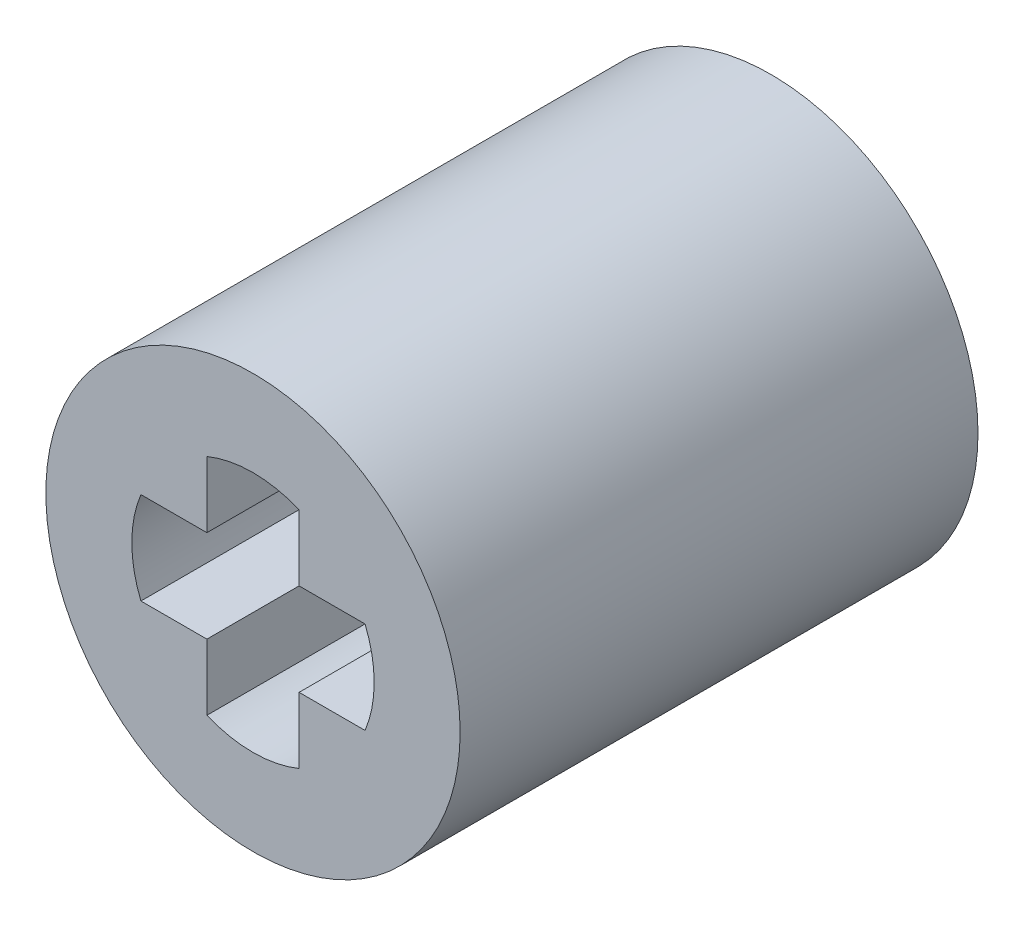
ISO-10303-21;
HEADER;
FILE_DESCRIPTION(('STEP AP214'),'2;1');
FILE_NAME('part.step','',(''),(''),'','','');
FILE_SCHEMA(('AUTOMOTIVE_DESIGN { 1 0 10303 214 1 1 1 1 }'));
ENDSEC;
DATA;
#1=APPLICATION_CONTEXT('core data for automotive mechanical design processes');
#2=APPLICATION_PROTOCOL_DEFINITION('international standard','automotive_design',2000,#1);
#3=PRODUCT_CONTEXT('',#1,'mechanical');
#4=PRODUCT('Part','Part','',(#3));
#5=PRODUCT_RELATED_PRODUCT_CATEGORY('part','',(#4));
#6=PRODUCT_DEFINITION_FORMATION('','',#4);
#7=PRODUCT_DEFINITION_CONTEXT('part definition',#1,'design');
#8=PRODUCT_DEFINITION('design','',#6,#7);
#9=PRODUCT_DEFINITION_SHAPE('','',#8);
#10=(LENGTH_UNIT() NAMED_UNIT(*) SI_UNIT(.MILLI.,.METRE.));
#11=(NAMED_UNIT(*) PLANE_ANGLE_UNIT() SI_UNIT($,.RADIAN.));
#12=(NAMED_UNIT(*) SI_UNIT($,.STERADIAN.) SOLID_ANGLE_UNIT());
#13=UNCERTAINTY_MEASURE_WITH_UNIT(LENGTH_MEASURE(1.E-05),#10,'distance_accuracy_value','');
#14=(GEOMETRIC_REPRESENTATION_CONTEXT(3) GLOBAL_UNCERTAINTY_ASSIGNED_CONTEXT((#13)) GLOBAL_UNIT_ASSIGNED_CONTEXT((#10,
#11,#12)) REPRESENTATION_CONTEXT('',''));
#15=CARTESIAN_POINT('',(0.,0.,0.));
#16=DIRECTION('',(0.,0.,1.));
#17=DIRECTION('',(1.,0.,0.));
#18=AXIS2_PLACEMENT_3D('',#15,#16,#17);
#19=CARTESIAN_POINT('',(0.,0.,0.));
#20=DIRECTION('',(0.,0.,1.));
#21=DIRECTION('',(1.,0.,0.));
#22=AXIS2_PLACEMENT_3D('',#19,#20,#21);
#23=PLANE('',#22);
#24=CARTESIAN_POINT('',(0.,0.,0.));
#25=DIRECTION('',(0.,0.,1.));
#26=DIRECTION('',(1.,0.,0.));
#27=AXIS2_PLACEMENT_3D('',#24,#25,#26);
#28=CIRCLE('',#27,1.5);
#29=CARTESIAN_POINT('',(-1.20743529847359,-0.89,0.));
#30=VERTEX_POINT('',#29);
#31=CARTESIAN_POINT('',(-0.889999999999999,-1.20743529847359,0.));
#32=VERTEX_POINT('',#31);
#33=EDGE_CURVE('E11',#30,#32,#28,.T.);
#34=ORIENTED_EDGE('',*,*,#33,.F.);
#35=DIRECTION('',(1.,0.,0.));
#36=VECTOR('',#35,1.);
#37=CARTESIAN_POINT('',(0.,-0.89,0.));
#38=LINE('',#37,#36);
#39=CARTESIAN_POINT('',(-0.89,-0.89,0.));
#40=VERTEX_POINT('',#39);
#41=EDGE_CURVE('E98',#30,#40,#38,.T.);
#42=ORIENTED_EDGE('',*,*,#41,.T.);
#43=DIRECTION('',(0.,-1.,0.));
#44=VECTOR('',#43,1.);
#45=CARTESIAN_POINT('',(-0.89,0.,0.));
#46=LINE('',#45,#44);
#47=EDGE_CURVE('E143',#40,#32,#46,.T.);
#48=ORIENTED_EDGE('',*,*,#47,.T.);
#49=EDGE_LOOP('',(#34,#42,#48));
#50=FACE_BOUND('',#49,.T.);
#51=ADVANCED_FACE('F47',(#50),#23,.F.);
#52=CARTESIAN_POINT('',(0.889999999999999,-1.20743529847359,0.));
#53=VERTEX_POINT('',#52);
#54=CARTESIAN_POINT('',(1.20743529847359,-0.89,0.));
#55=VERTEX_POINT('',#54);
#56=EDGE_CURVE('E57',#53,#55,#28,.T.);
#57=ORIENTED_EDGE('',*,*,#56,.F.);
#58=DIRECTION('',(0.,1.,0.));
#59=VECTOR('',#58,1.);
#60=CARTESIAN_POINT('',(0.89,0.,0.));
#61=LINE('',#60,#59);
#62=CARTESIAN_POINT('',(0.89,-0.89,0.));
#63=VERTEX_POINT('',#62);
#64=EDGE_CURVE('E205',#53,#63,#61,.T.);
#65=ORIENTED_EDGE('',*,*,#64,.T.);
#66=DIRECTION('',(1.,0.,0.));
#67=VECTOR('',#66,1.);
#68=CARTESIAN_POINT('',(0.,-0.89,0.));
#69=LINE('',#68,#67);
#70=EDGE_CURVE('E201',#63,#55,#69,.T.);
#71=ORIENTED_EDGE('',*,*,#70,.T.);
#72=EDGE_LOOP('',(#57,#65,#71));
#73=FACE_BOUND('',#72,.T.);
#74=ADVANCED_FACE('F313',(#73),#23,.F.);
#75=CARTESIAN_POINT('',(-1.11803398874989,1.,0.));
#76=VERTEX_POINT('',#75);
#77=CARTESIAN_POINT('',(-1.20743529847359,0.89,0.));
#78=VERTEX_POINT('',#77);
#79=EDGE_CURVE('E270',#76,#78,#28,.T.);
#80=ORIENTED_EDGE('',*,*,#79,.F.);
#81=DIRECTION('',(1.,0.,0.));
#82=VECTOR('',#81,1.);
#83=CARTESIAN_POINT('',(0.,1.,0.));
#84=LINE('',#83,#82);
#85=CARTESIAN_POINT('',(-0.89,1.,0.));
#86=VERTEX_POINT('',#85);
#87=EDGE_CURVE('E265',#76,#86,#84,.T.);
#88=ORIENTED_EDGE('',*,*,#87,.T.);
#89=DIRECTION('',(0.,-1.,0.));
#90=VECTOR('',#89,1.);
#91=CARTESIAN_POINT('',(-0.89,0.,0.));
#92=LINE('',#91,#90);
#93=CARTESIAN_POINT('',(-0.89,0.89,0.));
#94=VERTEX_POINT('',#93);
#95=EDGE_CURVE('E179',#86,#94,#92,.T.);
#96=ORIENTED_EDGE('',*,*,#95,.T.);
#97=DIRECTION('',(1.,0.,0.));
#98=VECTOR('',#97,1.);
#99=CARTESIAN_POINT('',(0.,0.89,0.));
#100=LINE('',#99,#98);
#101=EDGE_CURVE('E180',#78,#94,#100,.T.);
#102=ORIENTED_EDGE('',*,*,#101,.F.);
#103=EDGE_LOOP('',(#80,#88,#96,#102));
#104=FACE_BOUND('',#103,.T.);
#105=ADVANCED_FACE('F456',(#104),#23,.F.);
#106=CARTESIAN_POINT('',(1.20743529847359,0.89,0.));
#107=VERTEX_POINT('',#106);
#108=CARTESIAN_POINT('',(1.11803398874989,1.,0.));
#109=VERTEX_POINT('',#108);
#110=EDGE_CURVE('E263',#107,#109,#28,.T.);
#111=ORIENTED_EDGE('',*,*,#110,.F.);
#112=DIRECTION('',(1.,0.,0.));
#113=VECTOR('',#112,1.);
#114=CARTESIAN_POINT('',(0.,0.89,0.));
#115=LINE('',#114,#113);
#116=CARTESIAN_POINT('',(0.89,0.89,0.));
#117=VERTEX_POINT('',#116);
#118=EDGE_CURVE('E197',#117,#107,#115,.T.);
#119=ORIENTED_EDGE('',*,*,#118,.F.);
#120=DIRECTION('',(0.,1.,0.));
#121=VECTOR('',#120,1.);
#122=CARTESIAN_POINT('',(0.89,0.,0.));
#123=LINE('',#122,#121);
#124=CARTESIAN_POINT('',(0.89,1.,0.));
#125=VERTEX_POINT('',#124);
#126=EDGE_CURVE('E192',#117,#125,#123,.T.);
#127=ORIENTED_EDGE('',*,*,#126,.T.);
#128=EDGE_CURVE('E257',#125,#109,#84,.T.);
#129=ORIENTED_EDGE('',*,*,#128,.T.);
#130=EDGE_LOOP('',(#111,#119,#127,#129));
#131=FACE_BOUND('',#130,.T.);
#132=ADVANCED_FACE('F451',(#131),#23,.F.);
#133=CARTESIAN_POINT('',(0.,0.89,5.));
#134=DIRECTION('',(0.,1.,0.));
#135=DIRECTION('',(-1.,0.,0.));
#136=AXIS2_PLACEMENT_3D('',#133,#134,#135);
#137=PLANE('',#136);
#138=CARTESIAN_POINT('',(-2.16413955187737,0.89,0.));
#139=VERTEX_POINT('',#138);
#140=EDGE_CURVE('E175',#139,#78,#100,.T.);
#141=ORIENTED_EDGE('',*,*,#140,.T.);
#142=ORIENTED_EDGE('',*,*,#101,.T.);
#143=DIRECTION('',(0.,0.,-1.));
#144=VECTOR('',#143,1.);
#145=CARTESIAN_POINT('',(-0.89,0.89,5.));
#146=LINE('',#145,#144);
#147=CARTESIAN_POINT('',(-0.89,0.89,5.));
#148=VERTEX_POINT('',#147);
#149=EDGE_CURVE('E51',#148,#94,#146,.T.);
#150=ORIENTED_EDGE('',*,*,#149,.F.);
#151=DIRECTION('',(1.,0.,0.));
#152=VECTOR('',#151,1.);
#153=CARTESIAN_POINT('',(0.,0.89,5.));
#154=LINE('',#153,#152);
#155=CARTESIAN_POINT('',(-2.16413955187737,0.89,5.));
#156=VERTEX_POINT('',#155);
#157=EDGE_CURVE('E106',#156,#148,#154,.T.);
#158=ORIENTED_EDGE('',*,*,#157,.F.);
#159=DIRECTION('',(0.,0.,-1.));
#160=VECTOR('',#159,1.);
#161=CARTESIAN_POINT('',(-2.16413955187737,0.89,5.));
#162=LINE('',#161,#160);
#163=EDGE_CURVE('E75',#156,#139,#162,.T.);
#164=ORIENTED_EDGE('',*,*,#163,.T.);
#165=EDGE_LOOP('',(#141,#142,#150,#158,#164));
#166=FACE_BOUND('',#165,.T.);
#167=ADVANCED_FACE('F49',(#166),#137,.F.);
#168=CARTESIAN_POINT('',(-0.89,0.,5.));
#169=DIRECTION('',(1.,0.,0.));
#170=DIRECTION('',(0.,1.,0.));
#171=AXIS2_PLACEMENT_3D('',#168,#169,#170);
#172=PLANE('',#171);
#173=CARTESIAN_POINT('',(-0.89,2.16413955187737,0.));
#174=VERTEX_POINT('',#173);
#175=EDGE_CURVE('E181',#174,#86,#92,.T.);
#176=ORIENTED_EDGE('',*,*,#175,.F.);
#177=DIRECTION('',(0.,0.,-1.));
#178=VECTOR('',#177,1.);
#179=CARTESIAN_POINT('',(-0.89,2.16413955187737,5.));
#180=LINE('',#179,#178);
#181=CARTESIAN_POINT('',(-0.89,2.16413955187737,5.));
#182=VERTEX_POINT('',#181);
#183=EDGE_CURVE('E247',#182,#174,#180,.T.);
#184=ORIENTED_EDGE('',*,*,#183,.F.);
#185=DIRECTION('',(0.,-1.,0.));
#186=VECTOR('',#185,1.);
#187=CARTESIAN_POINT('',(-0.89,0.,5.));
#188=LINE('',#187,#186);
#189=EDGE_CURVE('E391',#182,#148,#188,.T.);
#190=ORIENTED_EDGE('',*,*,#189,.T.);
#191=ORIENTED_EDGE('',*,*,#149,.T.);
#192=ORIENTED_EDGE('',*,*,#95,.F.);
#193=EDGE_LOOP('',(#176,#184,#190,#191,#192));
#194=FACE_BOUND('',#193,.T.);
#195=ADVANCED_FACE('F418',(#194),#172,.T.);
#196=CARTESIAN_POINT('',(0.,0.,5.));
#197=DIRECTION('',(0.,0.,-1.));
#198=DIRECTION('',(-1.,0.,0.));
#199=AXIS2_PLACEMENT_3D('',#196,#197,#198);
#200=CYLINDRICAL_SURFACE('',#199,2.34);
#201=CARTESIAN_POINT('',(0.,0.,0.));
#202=DIRECTION('',(0.,0.,1.));
#203=DIRECTION('',(1.,0.,0.));
#204=AXIS2_PLACEMENT_3D('',#201,#202,#203);
#205=CIRCLE('',#204,2.34);
#206=CARTESIAN_POINT('',(0.89,2.16413955187737,0.));
#207=VERTEX_POINT('',#206);
#208=EDGE_CURVE('E185',#207,#174,#205,.T.);
#209=ORIENTED_EDGE('',*,*,#208,.F.);
#210=DIRECTION('',(0.,0.,-1.));
#211=VECTOR('',#210,1.);
#212=CARTESIAN_POINT('',(0.89,2.16413955187737,5.));
#213=LINE('',#212,#211);
#214=CARTESIAN_POINT('',(0.89,2.16413955187737,5.));
#215=VERTEX_POINT('',#214);
#216=EDGE_CURVE('E244',#215,#207,#213,.T.);
#217=ORIENTED_EDGE('',*,*,#216,.F.);
#218=CARTESIAN_POINT('',(0.,0.,5.));
#219=DIRECTION('',(0.,0.,1.));
#220=DIRECTION('',(1.,0.,0.));
#221=AXIS2_PLACEMENT_3D('',#218,#219,#220);
#222=CIRCLE('',#221,2.34);
#223=EDGE_CURVE('E169',#215,#182,#222,.T.);
#224=ORIENTED_EDGE('',*,*,#223,.T.);
#225=ORIENTED_EDGE('',*,*,#183,.T.);
#226=EDGE_LOOP('',(#209,#217,#224,#225));
#227=FACE_BOUND('',#226,.T.);
#228=ADVANCED_FACE('F421',(#227),#200,.F.);
#229=CARTESIAN_POINT('',(0.89,0.,5.));
#230=DIRECTION('',(-1.,0.,0.));
#231=DIRECTION('',(0.,-1.,0.));
#232=AXIS2_PLACEMENT_3D('',#229,#230,#231);
#233=PLANE('',#232);
#234=ORIENTED_EDGE('',*,*,#126,.F.);
#235=DIRECTION('',(0.,0.,-1.));
#236=VECTOR('',#235,1.);
#237=CARTESIAN_POINT('',(0.89,0.89,5.));
#238=LINE('',#237,#236);
#239=CARTESIAN_POINT('',(0.89,0.89,5.));
#240=VERTEX_POINT('',#239);
#241=EDGE_CURVE('E241',#240,#117,#238,.T.);
#242=ORIENTED_EDGE('',*,*,#241,.F.);
#243=DIRECTION('',(0.,1.,0.));
#244=VECTOR('',#243,1.);
#245=CARTESIAN_POINT('',(0.89,0.,5.));
#246=LINE('',#245,#244);
#247=EDGE_CURVE('E412',#240,#215,#246,.T.);
#248=ORIENTED_EDGE('',*,*,#247,.T.);
#249=ORIENTED_EDGE('',*,*,#216,.T.);
#250=EDGE_CURVE('E189',#125,#207,#123,.T.);
#251=ORIENTED_EDGE('',*,*,#250,.F.);
#252=EDGE_LOOP('',(#234,#242,#248,#249,#251));
#253=FACE_BOUND('',#252,.T.);
#254=ADVANCED_FACE('F424',(#253),#233,.T.);
#255=CARTESIAN_POINT('',(0.,0.89,5.));
#256=DIRECTION('',(0.,1.,0.));
#257=DIRECTION('',(-1.,0.,0.));
#258=AXIS2_PLACEMENT_3D('',#255,#256,#257);
#259=PLANE('',#258);
#260=ORIENTED_EDGE('',*,*,#118,.T.);
#261=CARTESIAN_POINT('',(2.16413955187737,0.89,0.));
#262=VERTEX_POINT('',#261);
#263=EDGE_CURVE('E196',#107,#262,#115,.T.);
#264=ORIENTED_EDGE('',*,*,#263,.T.);
#265=DIRECTION('',(0.,0.,-1.));
#266=VECTOR('',#265,1.);
#267=CARTESIAN_POINT('',(2.16413955187737,0.89,5.));
#268=LINE('',#267,#266);
#269=CARTESIAN_POINT('',(2.16413955187737,0.89,5.));
#270=VERTEX_POINT('',#269);
#271=EDGE_CURVE('E237',#270,#262,#268,.T.);
#272=ORIENTED_EDGE('',*,*,#271,.F.);
#273=DIRECTION('',(1.,0.,0.));
#274=VECTOR('',#273,1.);
#275=CARTESIAN_POINT('',(0.,0.89,5.));
#276=LINE('',#275,#274);
#277=EDGE_CURVE('E409',#240,#270,#276,.T.);
#278=ORIENTED_EDGE('',*,*,#277,.F.);
#279=ORIENTED_EDGE('',*,*,#241,.T.);
#280=EDGE_LOOP('',(#260,#264,#272,#278,#279));
#281=FACE_BOUND('',#280,.T.);
#282=ADVANCED_FACE('F429',(#281),#259,.F.);
#283=CARTESIAN_POINT('',(2.16413955187737,-0.89,0.));
#284=VERTEX_POINT('',#283);
#285=EDGE_CURVE('E191',#284,#262,#205,.T.);
#286=ORIENTED_EDGE('',*,*,#285,.F.);
#287=DIRECTION('',(0.,0.,-1.));
#288=VECTOR('',#287,1.);
#289=CARTESIAN_POINT('',(2.16413955187737,-0.89,5.));
#290=LINE('',#289,#288);
#291=CARTESIAN_POINT('',(2.16413955187737,-0.89,5.));
#292=VERTEX_POINT('',#291);
#293=EDGE_CURVE('E233',#292,#284,#290,.T.);
#294=ORIENTED_EDGE('',*,*,#293,.F.);
#295=EDGE_CURVE('E406',#292,#270,#222,.T.);
#296=ORIENTED_EDGE('',*,*,#295,.T.);
#297=ORIENTED_EDGE('',*,*,#271,.T.);
#298=EDGE_LOOP('',(#286,#294,#296,#297));
#299=FACE_BOUND('',#298,.T.);
#300=ADVANCED_FACE('F432',(#299),#200,.F.);
#301=CARTESIAN_POINT('',(0.,-0.89,5.));
#302=DIRECTION('',(0.,1.,0.));
#303=DIRECTION('',(-1.,0.,0.));
#304=AXIS2_PLACEMENT_3D('',#301,#302,#303);
#305=PLANE('',#304);
#306=ORIENTED_EDGE('',*,*,#70,.F.);
#307=DIRECTION('',(0.,0.,-1.));
#308=VECTOR('',#307,1.);
#309=CARTESIAN_POINT('',(0.89,-0.89,5.));
#310=LINE('',#309,#308);
#311=CARTESIAN_POINT('',(0.89,-0.89,5.));
#312=VERTEX_POINT('',#311);
#313=EDGE_CURVE('E229',#312,#63,#310,.T.);
#314=ORIENTED_EDGE('',*,*,#313,.F.);
#315=DIRECTION('',(1.,0.,0.));
#316=VECTOR('',#315,1.);
#317=CARTESIAN_POINT('',(0.,-0.89,5.));
#318=LINE('',#317,#316);
#319=EDGE_CURVE('E402',#312,#292,#318,.T.);
#320=ORIENTED_EDGE('',*,*,#319,.T.);
#321=ORIENTED_EDGE('',*,*,#293,.T.);
#322=EDGE_CURVE('E206',#55,#284,#69,.T.);
#323=ORIENTED_EDGE('',*,*,#322,.F.);
#324=EDGE_LOOP('',(#306,#314,#320,#321,#323));
#325=FACE_BOUND('',#324,.T.);
#326=ADVANCED_FACE('F435',(#325),#305,.T.);
#327=CARTESIAN_POINT('',(0.89,0.,5.));
#328=DIRECTION('',(-1.,0.,0.));
#329=DIRECTION('',(0.,-1.,0.));
#330=AXIS2_PLACEMENT_3D('',#327,#328,#329);
#331=PLANE('',#330);
#332=CARTESIAN_POINT('',(0.889999999999999,-2.16413955187737,0.));
#333=VERTEX_POINT('',#332);
#334=EDGE_CURVE('E207',#333,#53,#61,.T.);
#335=ORIENTED_EDGE('',*,*,#334,.F.);
#336=DIRECTION('',(0.,0.,-1.));
#337=VECTOR('',#336,1.);
#338=CARTESIAN_POINT('',(0.889999999999999,-2.16413955187737,5.));
#339=LINE('',#338,#337);
#340=CARTESIAN_POINT('',(0.889999999999999,-2.16413955187737,5.));
#341=VERTEX_POINT('',#340);
#342=EDGE_CURVE('E225',#341,#333,#339,.T.);
#343=ORIENTED_EDGE('',*,*,#342,.F.);
#344=DIRECTION('',(0.,1.,0.));
#345=VECTOR('',#344,1.);
#346=CARTESIAN_POINT('',(0.89,0.,5.));
#347=LINE('',#346,#345);
#348=EDGE_CURVE('E398',#341,#312,#347,.T.);
#349=ORIENTED_EDGE('',*,*,#348,.T.);
#350=ORIENTED_EDGE('',*,*,#313,.T.);
#351=ORIENTED_EDGE('',*,*,#64,.F.);
#352=EDGE_LOOP('',(#335,#343,#349,#350,#351));
#353=FACE_BOUND('',#352,.T.);
#354=ADVANCED_FACE('F318',(#353),#331,.T.);
#355=CARTESIAN_POINT('',(-0.889999999999999,-2.16413955187737,0.));
#356=VERTEX_POINT('',#355);
#357=EDGE_CURVE('E211',#356,#333,#205,.T.);
#358=ORIENTED_EDGE('',*,*,#357,.F.);
#359=DIRECTION('',(0.,0.,-1.));
#360=VECTOR('',#359,1.);
#361=CARTESIAN_POINT('',(-0.889999999999999,-2.16413955187737,5.));
#362=LINE('',#361,#360);
#363=CARTESIAN_POINT('',(-0.889999999999999,-2.16413955187737,5.));
#364=VERTEX_POINT('',#363);
#365=EDGE_CURVE('E147',#364,#356,#362,.T.);
#366=ORIENTED_EDGE('',*,*,#365,.F.);
#367=EDGE_CURVE('E157',#364,#341,#222,.T.);
#368=ORIENTED_EDGE('',*,*,#367,.T.);
#369=ORIENTED_EDGE('',*,*,#342,.T.);
#370=EDGE_LOOP('',(#358,#366,#368,#369));
#371=FACE_BOUND('',#370,.T.);
#372=ADVANCED_FACE('F397',(#371),#200,.F.);
#373=CARTESIAN_POINT('',(-0.89,0.,5.));
#374=DIRECTION('',(1.,0.,0.));
#375=DIRECTION('',(0.,1.,0.));
#376=AXIS2_PLACEMENT_3D('',#373,#374,#375);
#377=PLANE('',#376);
#378=ORIENTED_EDGE('',*,*,#47,.F.);
#379=DIRECTION('',(0.,0.,-1.));
#380=VECTOR('',#379,1.);
#381=CARTESIAN_POINT('',(-0.89,-0.89,5.));
#382=LINE('',#381,#380);
#383=CARTESIAN_POINT('',(-0.89,-0.89,5.));
#384=VERTEX_POINT('',#383);
#385=EDGE_CURVE('E137',#384,#40,#382,.T.);
#386=ORIENTED_EDGE('',*,*,#385,.F.);
#387=DIRECTION('',(0.,-1.,0.));
#388=VECTOR('',#387,1.);
#389=CARTESIAN_POINT('',(-0.89,0.,5.));
#390=LINE('',#389,#388);
#391=EDGE_CURVE('E141',#384,#364,#390,.T.);
#392=ORIENTED_EDGE('',*,*,#391,.T.);
#393=ORIENTED_EDGE('',*,*,#365,.T.);
#394=EDGE_CURVE('E214',#32,#356,#46,.T.);
#395=ORIENTED_EDGE('',*,*,#394,.F.);
#396=EDGE_LOOP('',(#378,#386,#392,#393,#395));
#397=FACE_BOUND('',#396,.T.);
#398=ADVANCED_FACE('F139',(#397),#377,.T.);
#399=CARTESIAN_POINT('',(0.,-0.89,5.));
#400=DIRECTION('',(0.,1.,0.));
#401=DIRECTION('',(-1.,0.,0.));
#402=AXIS2_PLACEMENT_3D('',#399,#400,#401);
#403=PLANE('',#402);
#404=CARTESIAN_POINT('',(-2.16413955187737,-0.89,0.));
#405=VERTEX_POINT('',#404);
#406=EDGE_CURVE('E215',#405,#30,#38,.T.);
#407=ORIENTED_EDGE('',*,*,#406,.F.);
#408=DIRECTION('',(0.,0.,-1.));
#409=VECTOR('',#408,1.);
#410=CARTESIAN_POINT('',(-2.16413955187737,-0.89,5.));
#411=LINE('',#410,#409);
#412=CARTESIAN_POINT('',(-2.16413955187737,-0.89,5.));
#413=VERTEX_POINT('',#412);
#414=EDGE_CURVE('E148',#413,#405,#411,.T.);
#415=ORIENTED_EDGE('',*,*,#414,.F.);
#416=DIRECTION('',(1.,0.,0.));
#417=VECTOR('',#416,1.);
#418=CARTESIAN_POINT('',(0.,-0.89,5.));
#419=LINE('',#418,#417);
#420=EDGE_CURVE('E154',#413,#384,#419,.T.);
#421=ORIENTED_EDGE('',*,*,#420,.T.);
#422=ORIENTED_EDGE('',*,*,#385,.T.);
#423=ORIENTED_EDGE('',*,*,#41,.F.);
#424=EDGE_LOOP('',(#407,#415,#421,#422,#423));
#425=FACE_BOUND('',#424,.T.);
#426=ADVANCED_FACE('F161',(#425),#403,.T.);
#427=EDGE_CURVE('E190',#139,#405,#205,.T.);
#428=ORIENTED_EDGE('',*,*,#427,.F.);
#429=ORIENTED_EDGE('',*,*,#163,.F.);
#430=EDGE_CURVE('E164',#156,#413,#222,.T.);
#431=ORIENTED_EDGE('',*,*,#430,.T.);
#432=ORIENTED_EDGE('',*,*,#414,.T.);
#433=EDGE_LOOP('',(#428,#429,#431,#432));
#434=FACE_BOUND('',#433,.T.);
#435=ADVANCED_FACE('F388',(#434),#200,.F.);
#436=CARTESIAN_POINT('',(0.,0.,5.));
#437=DIRECTION('',(0.,0.,-1.));
#438=DIRECTION('',(-1.,0.,0.));
#439=AXIS2_PLACEMENT_3D('',#436,#437,#438);
#440=CYLINDRICAL_SURFACE('',#439,4.);
#441=CARTESIAN_POINT('',(0.,0.,5.));
#442=DIRECTION('',(0.,0.,1.));
#443=DIRECTION('',(1.,0.,0.));
#444=AXIS2_PLACEMENT_3D('',#441,#442,#443);
#445=CIRCLE('',#444,4.);
#446=CARTESIAN_POINT('',(4.,0.,5.));
#447=VERTEX_POINT('',#446);
#448=EDGE_CURVE('E167',#447,#447,#445,.T.);
#449=ORIENTED_EDGE('',*,*,#448,.F.);
#450=EDGE_LOOP('',(#449));
#451=FACE_BOUND('',#450,.T.);
#452=CARTESIAN_POINT('',(0.,0.,-5.));
#453=DIRECTION('',(0.,0.,1.));
#454=DIRECTION('',(1.,0.,0.));
#455=AXIS2_PLACEMENT_3D('',#452,#453,#454);
#456=CIRCLE('',#455,4.);
#457=CARTESIAN_POINT('',(4.,0.,-5.));
#458=VERTEX_POINT('',#457);
#459=EDGE_CURVE('E337',#458,#458,#456,.T.);
#460=ORIENTED_EDGE('',*,*,#459,.T.);
#461=EDGE_LOOP('',(#460));
#462=FACE_BOUND('',#461,.T.);
#463=ADVANCED_FACE('F591',(#451,#462),#440,.T.);
#464=CARTESIAN_POINT('',(0.,0.,5.));
#465=DIRECTION('',(0.,0.,1.));
#466=DIRECTION('',(1.,0.,0.));
#467=AXIS2_PLACEMENT_3D('',#464,#465,#466);
#468=PLANE('',#467);
#469=ORIENTED_EDGE('',*,*,#157,.T.);
#470=ORIENTED_EDGE('',*,*,#189,.F.);
#471=ORIENTED_EDGE('',*,*,#223,.F.);
#472=ORIENTED_EDGE('',*,*,#247,.F.);
#473=ORIENTED_EDGE('',*,*,#277,.T.);
#474=ORIENTED_EDGE('',*,*,#295,.F.);
#475=ORIENTED_EDGE('',*,*,#319,.F.);
#476=ORIENTED_EDGE('',*,*,#348,.F.);
#477=ORIENTED_EDGE('',*,*,#367,.F.);
#478=ORIENTED_EDGE('',*,*,#391,.F.);
#479=ORIENTED_EDGE('',*,*,#420,.F.);
#480=ORIENTED_EDGE('',*,*,#430,.F.);
#481=EDGE_LOOP('',(#469,#470,#471,#472,#473,#474,#475,#476,#477,#478,#479,#480));
#482=FACE_BOUND('',#481,.T.);
#483=ORIENTED_EDGE('',*,*,#448,.T.);
#484=EDGE_LOOP('',(#483));
#485=FACE_BOUND('',#484,.T.);
#486=ADVANCED_FACE('F152',(#482,#485),#468,.T.);
#487=CARTESIAN_POINT('',(0.,0.,0.));
#488=DIRECTION('',(0.,0.,1.));
#489=DIRECTION('',(1.,0.,0.));
#490=AXIS2_PLACEMENT_3D('',#487,#488,#489);
#491=PLANE('',#490);
#492=ORIENTED_EDGE('',*,*,#140,.F.);
#493=ORIENTED_EDGE('',*,*,#427,.T.);
#494=ORIENTED_EDGE('',*,*,#406,.T.);
#495=EDGE_CURVE('E59',#78,#30,#28,.T.);
#496=ORIENTED_EDGE('',*,*,#495,.F.);
#497=EDGE_LOOP('',(#492,#493,#494,#496));
#498=FACE_BOUND('',#497,.T.);
#499=ADVANCED_FACE('F386',(#498),#491,.T.);
#500=EDGE_CURVE('E292',#32,#53,#28,.T.);
#501=ORIENTED_EDGE('',*,*,#500,.F.);
#502=ORIENTED_EDGE('',*,*,#394,.T.);
#503=ORIENTED_EDGE('',*,*,#357,.T.);
#504=ORIENTED_EDGE('',*,*,#334,.T.);
#505=EDGE_LOOP('',(#501,#502,#503,#504));
#506=FACE_BOUND('',#505,.T.);
#507=ADVANCED_FACE('F395',(#506),#491,.T.);
#508=EDGE_CURVE('E284',#55,#107,#28,.T.);
#509=ORIENTED_EDGE('',*,*,#508,.F.);
#510=ORIENTED_EDGE('',*,*,#322,.T.);
#511=ORIENTED_EDGE('',*,*,#285,.T.);
#512=ORIENTED_EDGE('',*,*,#263,.F.);
#513=EDGE_LOOP('',(#509,#510,#511,#512));
#514=FACE_BOUND('',#513,.T.);
#515=ADVANCED_FACE('F437',(#514),#491,.T.);
#516=CARTESIAN_POINT('',(0.,0.,-5.));
#517=DIRECTION('',(0.,0.,1.));
#518=DIRECTION('',(1.,0.,0.));
#519=AXIS2_PLACEMENT_3D('',#516,#517,#518);
#520=CYLINDRICAL_SURFACE('',#519,1.5);
#521=ORIENTED_EDGE('',*,*,#79,.T.);
#522=ORIENTED_EDGE('',*,*,#495,.T.);
#523=ORIENTED_EDGE('',*,*,#33,.T.);
#524=ORIENTED_EDGE('',*,*,#500,.T.);
#525=ORIENTED_EDGE('',*,*,#56,.T.);
#526=ORIENTED_EDGE('',*,*,#508,.T.);
#527=ORIENTED_EDGE('',*,*,#110,.T.);
#528=DIRECTION('',(0.,0.,1.));
#529=VECTOR('',#528,1.);
#530=CARTESIAN_POINT('',(1.11803398874989,1.,-5.));
#531=LINE('',#530,#529);
#532=CARTESIAN_POINT('',(1.11803398874989,1.,-5.));
#533=VERTEX_POINT('',#532);
#534=EDGE_CURVE('E66',#533,#109,#531,.T.);
#535=ORIENTED_EDGE('',*,*,#534,.F.);
#536=CARTESIAN_POINT('',(0.,0.,-5.));
#537=DIRECTION('',(0.,0.,1.));
#538=DIRECTION('',(1.,0.,0.));
#539=AXIS2_PLACEMENT_3D('',#536,#537,#538);
#540=CIRCLE('',#539,1.5);
#541=CARTESIAN_POINT('',(-1.11803398874989,1.,-5.));
#542=VERTEX_POINT('',#541);
#543=EDGE_CURVE('E274',#542,#533,#540,.T.);
#544=ORIENTED_EDGE('',*,*,#543,.F.);
#545=DIRECTION('',(0.,0.,1.));
#546=VECTOR('',#545,1.);
#547=CARTESIAN_POINT('',(-1.11803398874989,1.,-5.));
#548=LINE('',#547,#546);
#549=EDGE_CURVE('E335',#542,#76,#548,.T.);
#550=ORIENTED_EDGE('',*,*,#549,.T.);
#551=EDGE_LOOP('',(#521,#522,#523,#524,#525,#526,#527,#535,#544,#550));
#552=FACE_BOUND('',#551,.T.);
#553=ADVANCED_FACE('F304',(#552),#520,.F.);
#554=CARTESIAN_POINT('',(0.,1.,-5.));
#555=DIRECTION('',(0.,-1.,0.));
#556=DIRECTION('',(0.,0.,-1.));
#557=AXIS2_PLACEMENT_3D('',#554,#555,#556);
#558=PLANE('',#557);
#559=ORIENTED_EDGE('',*,*,#87,.F.);
#560=ORIENTED_EDGE('',*,*,#549,.F.);
#561=DIRECTION('',(1.,0.,0.));
#562=VECTOR('',#561,1.);
#563=CARTESIAN_POINT('',(0.,1.,-5.));
#564=LINE('',#563,#562);
#565=EDGE_CURVE('E341',#542,#533,#564,.T.);
#566=ORIENTED_EDGE('',*,*,#565,.T.);
#567=ORIENTED_EDGE('',*,*,#534,.T.);
#568=ORIENTED_EDGE('',*,*,#128,.F.);
#569=EDGE_CURVE('E266',#86,#125,#84,.T.);
#570=ORIENTED_EDGE('',*,*,#569,.F.);
#571=EDGE_LOOP('',(#559,#560,#566,#567,#568,#570));
#572=FACE_BOUND('',#571,.T.);
#573=ADVANCED_FACE('F356',(#572),#558,.T.);
#574=CARTESIAN_POINT('',(0.,0.,-5.));
#575=DIRECTION('',(0.,0.,1.));
#576=DIRECTION('',(1.,0.,0.));
#577=AXIS2_PLACEMENT_3D('',#574,#575,#576);
#578=PLANE('',#577);
#579=ORIENTED_EDGE('',*,*,#543,.T.);
#580=ORIENTED_EDGE('',*,*,#565,.F.);
#581=EDGE_LOOP('',(#579,#580));
#582=FACE_BOUND('',#581,.T.);
#583=ORIENTED_EDGE('',*,*,#459,.F.);
#584=EDGE_LOOP('',(#583));
#585=FACE_BOUND('',#584,.T.);
#586=ADVANCED_FACE('F350',(#582,#585),#578,.F.);
#587=ORIENTED_EDGE('',*,*,#569,.T.);
#588=ORIENTED_EDGE('',*,*,#250,.T.);
#589=ORIENTED_EDGE('',*,*,#208,.T.);
#590=ORIENTED_EDGE('',*,*,#175,.T.);
#591=EDGE_LOOP('',(#587,#588,#589,#590));
#592=FACE_BOUND('',#591,.T.);
#593=ADVANCED_FACE('F440',(#592),#491,.T.);
#594=CLOSED_SHELL('',(#51,#74,#105,#132,#167,#195,#228,#254,#282,#300,#326,#354,#372,#398,#426,
#435,#463,#486,#499,#507,#515,#553,#573,#586,#593));
#595=MANIFOLD_SOLID_BREP('B2',#594);
#596=ADVANCED_BREP_SHAPE_REPRESENTATION('',(#18,#595),#14);
#597=SHAPE_DEFINITION_REPRESENTATION(#9,#596);
ENDSEC;
END-ISO-10303-21;
